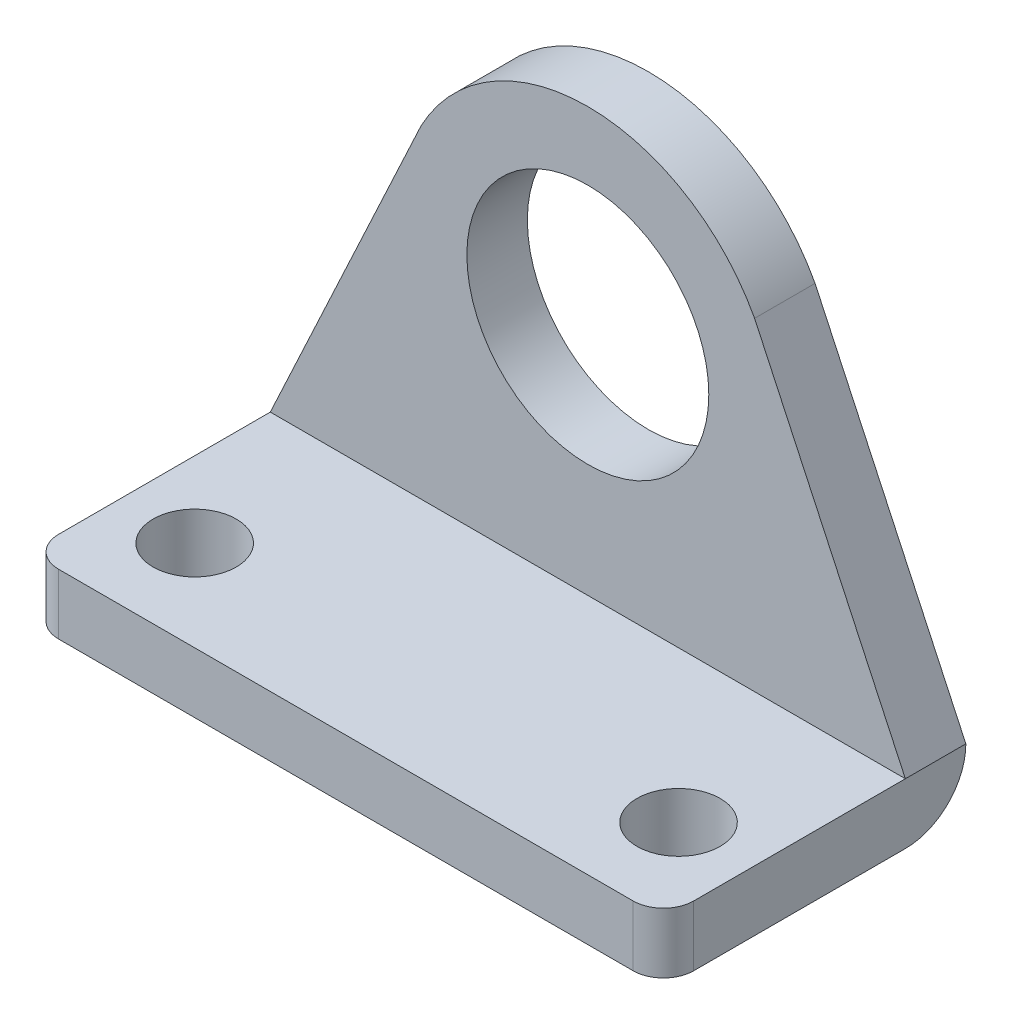
ISO-10303-21;
HEADER;
FILE_DESCRIPTION(('STEP AP214'),'2;1');
FILE_NAME('part.step','',(''),(''),'','','');
FILE_SCHEMA(('AUTOMOTIVE_DESIGN { 1 0 10303 214 1 1 1 1 }'));
ENDSEC;
DATA;
#1=APPLICATION_CONTEXT('core data for automotive mechanical design processes');
#2=APPLICATION_PROTOCOL_DEFINITION('international standard','automotive_design',2000,#1);
#3=PRODUCT_CONTEXT('',#1,'mechanical');
#4=PRODUCT('Part','Part','',(#3));
#5=PRODUCT_RELATED_PRODUCT_CATEGORY('part','',(#4));
#6=PRODUCT_DEFINITION_FORMATION('','',#4);
#7=PRODUCT_DEFINITION_CONTEXT('part definition',#1,'design');
#8=PRODUCT_DEFINITION('design','',#6,#7);
#9=PRODUCT_DEFINITION_SHAPE('','',#8);
#10=(LENGTH_UNIT() NAMED_UNIT(*) SI_UNIT(.MILLI.,.METRE.));
#11=(NAMED_UNIT(*) PLANE_ANGLE_UNIT() SI_UNIT($,.RADIAN.));
#12=(NAMED_UNIT(*) SI_UNIT($,.STERADIAN.) SOLID_ANGLE_UNIT());
#13=UNCERTAINTY_MEASURE_WITH_UNIT(LENGTH_MEASURE(1.E-05),#10,'distance_accuracy_value','');
#14=(GEOMETRIC_REPRESENTATION_CONTEXT(3) GLOBAL_UNCERTAINTY_ASSIGNED_CONTEXT((#13)) GLOBAL_UNIT_ASSIGNED_CONTEXT((#10,
#11,#12)) REPRESENTATION_CONTEXT('',''));
#15=CARTESIAN_POINT('',(0.,0.,0.));
#16=DIRECTION('',(0.,0.,1.));
#17=DIRECTION('',(1.,0.,0.));
#18=AXIS2_PLACEMENT_3D('',#15,#16,#17);
#19=CARTESIAN_POINT('',(21.,15.5,4.));
#20=DIRECTION('',(0.,0.,-1.));
#21=DIRECTION('',(-1.,0.,0.));
#22=AXIS2_PLACEMENT_3D('',#19,#20,#21);
#23=PLANE('',#22);
#24=DIRECTION('',(-0.422618261740697,-0.906307787036651,0.));
#25=VECTOR('',#24,1.);
#26=CARTESIAN_POINT('',(0.,0.,4.));
#27=LINE('',#26,#25);
#28=CARTESIAN_POINT('',(9.9719121218709,21.3848345560655,4.));
#29=VERTEX_POINT('',#28);
#30=CARTESIAN_POINT('',(0.,0.,4.));
#31=VERTEX_POINT('',#30);
#32=EDGE_CURVE('E177',#29,#31,#27,.T.);
#33=ORIENTED_EDGE('',*,*,#32,.T.);
#34=DIRECTION('',(1.,0.,0.));
#35=VECTOR('',#34,1.);
#36=CARTESIAN_POINT('',(42.,0.,4.));
#37=LINE('',#36,#35);
#38=CARTESIAN_POINT('',(42.,0.,4.));
#39=VERTEX_POINT('',#38);
#40=EDGE_CURVE('E216',#31,#39,#37,.T.);
#41=ORIENTED_EDGE('',*,*,#40,.T.);
#42=DIRECTION('',(-0.422618261740697,0.906307787036651,0.));
#43=VECTOR('',#42,1.);
#44=CARTESIAN_POINT('',(32.0280878781291,21.3848345560655,4.));
#45=LINE('',#44,#43);
#46=CARTESIAN_POINT('',(32.0280878781291,21.3848345560655,4.));
#47=VERTEX_POINT('',#46);
#48=EDGE_CURVE('E171',#39,#47,#45,.T.);
#49=ORIENTED_EDGE('',*,*,#48,.T.);
#50=CARTESIAN_POINT('',(21.,15.5,4.));
#51=DIRECTION('',(0.,0.,1.));
#52=DIRECTION('',(-1.,0.,0.));
#53=AXIS2_PLACEMENT_3D('',#50,#51,#52);
#54=CIRCLE('',#53,12.5);
#55=EDGE_CURVE('E63',#47,#29,#54,.T.);
#56=ORIENTED_EDGE('',*,*,#55,.T.);
#57=EDGE_LOOP('',(#33,#41,#49,#56));
#58=FACE_BOUND('',#57,.T.);
#59=CARTESIAN_POINT('',(21.,15.5,4.));
#60=DIRECTION('',(0.,0.,1.));
#61=DIRECTION('',(1.,0.,0.));
#62=AXIS2_PLACEMENT_3D('',#59,#60,#61);
#63=CIRCLE('',#62,8.);
#64=CARTESIAN_POINT('',(29.,15.5,4.));
#65=VERTEX_POINT('',#64);
#66=EDGE_CURVE('E161',#65,#65,#63,.T.);
#67=ORIENTED_EDGE('',*,*,#66,.F.);
#68=EDGE_LOOP('',(#67));
#69=FACE_BOUND('',#68,.T.);
#70=ADVANCED_FACE('F45',(#58,#69),#23,.F.);
#71=CARTESIAN_POINT('',(21.,15.5,0.));
#72=DIRECTION('',(0.,0.,-1.));
#73=DIRECTION('',(-1.,0.,0.));
#74=AXIS2_PLACEMENT_3D('',#71,#72,#73);
#75=PLANE('',#74);
#76=DIRECTION('',(1.,0.,0.));
#77=VECTOR('',#76,1.);
#78=CARTESIAN_POINT('',(0.,0.,0.));
#79=LINE('',#78,#77);
#80=CARTESIAN_POINT('',(0.,0.,0.));
#81=VERTEX_POINT('',#80);
#82=CARTESIAN_POINT('',(42.,0.,0.));
#83=VERTEX_POINT('',#82);
#84=EDGE_CURVE('E155',#81,#83,#79,.T.);
#85=ORIENTED_EDGE('',*,*,#84,.F.);
#86=DIRECTION('',(-0.422618261740697,-0.906307787036651,0.));
#87=VECTOR('',#86,1.);
#88=CARTESIAN_POINT('',(0.,0.,0.));
#89=LINE('',#88,#87);
#90=CARTESIAN_POINT('',(9.9719121218709,21.3848345560655,0.));
#91=VERTEX_POINT('',#90);
#92=EDGE_CURVE('E174',#91,#81,#89,.T.);
#93=ORIENTED_EDGE('',*,*,#92,.F.);
#94=CARTESIAN_POINT('',(21.,15.5,0.));
#95=DIRECTION('',(0.,0.,1.));
#96=DIRECTION('',(-1.,0.,0.));
#97=AXIS2_PLACEMENT_3D('',#94,#95,#96);
#98=CIRCLE('',#97,12.5);
#99=CARTESIAN_POINT('',(32.0280878781291,21.3848345560655,0.));
#100=VERTEX_POINT('',#99);
#101=EDGE_CURVE('E81',#100,#91,#98,.T.);
#102=ORIENTED_EDGE('',*,*,#101,.F.);
#103=DIRECTION('',(-0.422618261740697,0.906307787036651,0.));
#104=VECTOR('',#103,1.);
#105=CARTESIAN_POINT('',(32.0280878781291,21.3848345560655,0.));
#106=LINE('',#105,#104);
#107=EDGE_CURVE('E76',#83,#100,#106,.T.);
#108=ORIENTED_EDGE('',*,*,#107,.F.);
#109=EDGE_LOOP('',(#85,#93,#102,#108));
#110=FACE_BOUND('',#109,.T.);
#111=CARTESIAN_POINT('',(21.,15.5,0.));
#112=DIRECTION('',(0.,0.,1.));
#113=DIRECTION('',(1.,0.,0.));
#114=AXIS2_PLACEMENT_3D('',#111,#112,#113);
#115=CIRCLE('',#114,8.);
#116=CARTESIAN_POINT('',(29.,15.5,0.));
#117=VERTEX_POINT('',#116);
#118=EDGE_CURVE('E157',#117,#117,#115,.T.);
#119=ORIENTED_EDGE('',*,*,#118,.T.);
#120=EDGE_LOOP('',(#119));
#121=FACE_BOUND('',#120,.T.);
#122=ADVANCED_FACE('F200',(#110,#121),#75,.T.);
#123=CARTESIAN_POINT('',(32.0280878781291,21.3848345560655,4.));
#124=DIRECTION('',(-0.906307787036651,-0.422618261740697,0.));
#125=DIRECTION('',(0.422618261740697,-0.906307787036651,0.));
#126=AXIS2_PLACEMENT_3D('',#123,#124,#125);
#127=PLANE('',#126);
#128=ORIENTED_EDGE('',*,*,#107,.T.);
#129=DIRECTION('',(0.,0.,-1.));
#130=VECTOR('',#129,1.);
#131=CARTESIAN_POINT('',(32.0280878781291,21.3848345560655,4.));
#132=LINE('',#131,#130);
#133=EDGE_CURVE('E55',#47,#100,#132,.T.);
#134=ORIENTED_EDGE('',*,*,#133,.F.);
#135=ORIENTED_EDGE('',*,*,#48,.F.);
#136=DIRECTION('',(0.,0.,-1.));
#137=VECTOR('',#136,1.);
#138=CARTESIAN_POINT('',(42.,0.,4.));
#139=LINE('',#138,#137);
#140=EDGE_CURVE('E11',#39,#83,#139,.T.);
#141=ORIENTED_EDGE('',*,*,#140,.T.);
#142=EDGE_LOOP('',(#128,#134,#135,#141));
#143=FACE_BOUND('',#142,.T.);
#144=ADVANCED_FACE('F47',(#143),#127,.F.);
#145=CARTESIAN_POINT('',(21.,15.5,4.));
#146=DIRECTION('',(0.,0.,-1.));
#147=DIRECTION('',(-1.,0.,0.));
#148=AXIS2_PLACEMENT_3D('',#145,#146,#147);
#149=CYLINDRICAL_SURFACE('',#148,12.5);
#150=ORIENTED_EDGE('',*,*,#101,.T.);
#151=DIRECTION('',(0.,0.,-1.));
#152=VECTOR('',#151,1.);
#153=CARTESIAN_POINT('',(9.9719121218709,21.3848345560655,4.));
#154=LINE('',#153,#152);
#155=EDGE_CURVE('E193',#29,#91,#154,.T.);
#156=ORIENTED_EDGE('',*,*,#155,.F.);
#157=ORIENTED_EDGE('',*,*,#55,.F.);
#158=ORIENTED_EDGE('',*,*,#133,.T.);
#159=EDGE_LOOP('',(#150,#156,#157,#158));
#160=FACE_BOUND('',#159,.T.);
#161=ADVANCED_FACE('F196',(#160),#149,.T.);
#162=CARTESIAN_POINT('',(0.,0.,4.));
#163=DIRECTION('',(0.906307787036651,-0.422618261740697,0.));
#164=DIRECTION('',(0.422618261740697,0.906307787036651,0.));
#165=AXIS2_PLACEMENT_3D('',#162,#163,#164);
#166=PLANE('',#165);
#167=ORIENTED_EDGE('',*,*,#92,.T.);
#168=DIRECTION('',(0.,0.,-1.));
#169=VECTOR('',#168,1.);
#170=CARTESIAN_POINT('',(0.,0.,4.));
#171=LINE('',#170,#169);
#172=EDGE_CURVE('E180',#31,#81,#171,.T.);
#173=ORIENTED_EDGE('',*,*,#172,.F.);
#174=ORIENTED_EDGE('',*,*,#32,.F.);
#175=ORIENTED_EDGE('',*,*,#155,.T.);
#176=EDGE_LOOP('',(#167,#173,#174,#175));
#177=FACE_BOUND('',#176,.T.);
#178=ADVANCED_FACE('F204',(#177),#166,.F.);
#179=CARTESIAN_POINT('',(21.,15.5,4.));
#180=DIRECTION('',(0.,0.,-1.));
#181=DIRECTION('',(-1.,0.,0.));
#182=AXIS2_PLACEMENT_3D('',#179,#180,#181);
#183=CYLINDRICAL_SURFACE('',#182,8.);
#184=ORIENTED_EDGE('',*,*,#66,.T.);
#185=EDGE_LOOP('',(#184));
#186=FACE_BOUND('',#185,.T.);
#187=ORIENTED_EDGE('',*,*,#118,.F.);
#188=EDGE_LOOP('',(#187));
#189=FACE_BOUND('',#188,.T.);
#190=ADVANCED_FACE('F227',(#186,#189),#183,.F.);
#191=CARTESIAN_POINT('',(47.6568542494924,0.,4.00000000000001));
#192=DIRECTION('',(-1.,0.,0.));
#193=DIRECTION('',(0.,0.,1.));
#194=AXIS2_PLACEMENT_3D('',#191,#192,#193);
#195=CYLINDRICAL_SURFACE('',#194,4.);
#196=CARTESIAN_POINT('',(42.,0.,4.00000000000001));
#197=DIRECTION('',(-1.,0.,0.));
#198=DIRECTION('',(0.,0.,1.));
#199=AXIS2_PLACEMENT_3D('',#196,#197,#198);
#200=CIRCLE('',#199,4.);
#201=CARTESIAN_POINT('',(42.,-4.,4.));
#202=VERTEX_POINT('',#201);
#203=EDGE_CURVE('E132',#202,#83,#200,.F.);
#204=ORIENTED_EDGE('',*,*,#203,.F.);
#205=DIRECTION('',(-1.,0.,0.));
#206=VECTOR('',#205,1.);
#207=CARTESIAN_POINT('',(47.6568542494924,-4.,4.00000000000001));
#208=LINE('',#207,#206);
#209=CARTESIAN_POINT('',(0.,-4.,4.));
#210=VERTEX_POINT('',#209);
#211=EDGE_CURVE('E143',#202,#210,#208,.T.);
#212=ORIENTED_EDGE('',*,*,#211,.T.);
#213=CARTESIAN_POINT('',(0.,0.,4.));
#214=DIRECTION('',(-1.,0.,0.));
#215=DIRECTION('',(0.,0.,1.));
#216=AXIS2_PLACEMENT_3D('',#213,#214,#215);
#217=CIRCLE('',#216,4.);
#218=EDGE_CURVE('E152',#81,#210,#217,.T.);
#219=ORIENTED_EDGE('',*,*,#218,.F.);
#220=ORIENTED_EDGE('',*,*,#84,.T.);
#221=EDGE_LOOP('',(#204,#212,#219,#220));
#222=FACE_BOUND('',#221,.T.);
#223=ADVANCED_FACE('F154',(#222),#195,.T.);
#224=CARTESIAN_POINT('',(0.,0.,4.));
#225=DIRECTION('',(-1.,0.,0.));
#226=DIRECTION('',(0.,0.,1.));
#227=AXIS2_PLACEMENT_3D('',#224,#225,#226);
#228=PLANE('',#227);
#229=ORIENTED_EDGE('',*,*,#218,.T.);
#230=DIRECTION('',(0.,0.,-1.));
#231=VECTOR('',#230,1.);
#232=CARTESIAN_POINT('',(0.,-4.,4.));
#233=LINE('',#232,#231);
#234=CARTESIAN_POINT('',(0.,-4.,18.));
#235=VERTEX_POINT('',#234);
#236=EDGE_CURVE('E147',#235,#210,#233,.T.);
#237=ORIENTED_EDGE('',*,*,#236,.F.);
#238=DIRECTION('',(0.,1.,0.));
#239=VECTOR('',#238,1.);
#240=CARTESIAN_POINT('',(0.,-4.,18.));
#241=LINE('',#240,#239);
#242=CARTESIAN_POINT('',(0.,0.,18.));
#243=VERTEX_POINT('',#242);
#244=EDGE_CURVE('E211',#235,#243,#241,.T.);
#245=ORIENTED_EDGE('',*,*,#244,.T.);
#246=DIRECTION('',(0.,0.,-1.));
#247=VECTOR('',#246,1.);
#248=CARTESIAN_POINT('',(0.,0.,4.));
#249=LINE('',#248,#247);
#250=EDGE_CURVE('E140',#243,#31,#249,.T.);
#251=ORIENTED_EDGE('',*,*,#250,.T.);
#252=ORIENTED_EDGE('',*,*,#172,.T.);
#253=EDGE_LOOP('',(#229,#237,#245,#251,#252));
#254=FACE_BOUND('',#253,.T.);
#255=ADVANCED_FACE('F207',(#254),#228,.T.);
#256=CARTESIAN_POINT('',(42.,-4.,18.));
#257=DIRECTION('',(-1.,0.,0.));
#258=DIRECTION('',(0.,0.,1.));
#259=AXIS2_PLACEMENT_3D('',#256,#257,#258);
#260=PLANE('',#259);
#261=ORIENTED_EDGE('',*,*,#140,.F.);
#262=DIRECTION('',(0.,0.,1.));
#263=VECTOR('',#262,1.);
#264=CARTESIAN_POINT('',(42.,0.,18.));
#265=LINE('',#264,#263);
#266=CARTESIAN_POINT('',(42.,0.,18.));
#267=VERTEX_POINT('',#266);
#268=EDGE_CURVE('E88',#39,#267,#265,.T.);
#269=ORIENTED_EDGE('',*,*,#268,.T.);
#270=DIRECTION('',(0.,1.,0.));
#271=VECTOR('',#270,1.);
#272=CARTESIAN_POINT('',(42.,-4.,18.));
#273=LINE('',#272,#271);
#274=CARTESIAN_POINT('',(42.,-4.,18.));
#275=VERTEX_POINT('',#274);
#276=EDGE_CURVE('E135',#275,#267,#273,.T.);
#277=ORIENTED_EDGE('',*,*,#276,.F.);
#278=DIRECTION('',(0.,0.,1.));
#279=VECTOR('',#278,1.);
#280=CARTESIAN_POINT('',(42.,-4.,18.));
#281=LINE('',#280,#279);
#282=EDGE_CURVE('E127',#202,#275,#281,.T.);
#283=ORIENTED_EDGE('',*,*,#282,.F.);
#284=ORIENTED_EDGE('',*,*,#203,.T.);
#285=EDGE_LOOP('',(#261,#269,#277,#283,#284));
#286=FACE_BOUND('',#285,.T.);
#287=ADVANCED_FACE('F130',(#286),#260,.F.);
#288=CARTESIAN_POINT('',(2.,-4.,18.));
#289=DIRECTION('',(0.,-1.,0.));
#290=DIRECTION('',(0.,0.,-1.));
#291=AXIS2_PLACEMENT_3D('',#288,#289,#290);
#292=PLANE('',#291);
#293=CARTESIAN_POINT('',(37.,-4.,14.));
#294=DIRECTION('',(0.,-1.,0.));
#295=DIRECTION('',(0.,0.,-1.));
#296=AXIS2_PLACEMENT_3D('',#293,#294,#295);
#297=CIRCLE('',#296,2.75);
#298=CARTESIAN_POINT('',(37.,-4.,11.25));
#299=VERTEX_POINT('',#298);
#300=EDGE_CURVE('E220',#299,#299,#297,.T.);
#301=ORIENTED_EDGE('',*,*,#300,.F.);
#302=EDGE_LOOP('',(#301));
#303=FACE_BOUND('',#302,.T.);
#304=ORIENTED_EDGE('',*,*,#211,.F.);
#305=ORIENTED_EDGE('',*,*,#282,.T.);
#306=CARTESIAN_POINT('',(40.,-4.,18.));
#307=DIRECTION('',(0.,-1.,0.));
#308=DIRECTION('',(0.,0.,1.));
#309=AXIS2_PLACEMENT_3D('',#306,#307,#308);
#310=CIRCLE('',#309,2.);
#311=CARTESIAN_POINT('',(40.,-4.,20.));
#312=VERTEX_POINT('',#311);
#313=EDGE_CURVE('E139',#275,#312,#310,.T.);
#314=ORIENTED_EDGE('',*,*,#313,.T.);
#315=DIRECTION('',(-1.,0.,0.));
#316=VECTOR('',#315,1.);
#317=CARTESIAN_POINT('',(2.00000000000001,-4.,20.));
#318=LINE('',#317,#316);
#319=CARTESIAN_POINT('',(2.00000000000001,-4.,20.));
#320=VERTEX_POINT('',#319);
#321=EDGE_CURVE('E379',#312,#320,#318,.T.);
#322=ORIENTED_EDGE('',*,*,#321,.T.);
#323=CARTESIAN_POINT('',(2.,-4.,18.));
#324=DIRECTION('',(0.,-1.,0.));
#325=DIRECTION('',(0.,0.,-1.));
#326=AXIS2_PLACEMENT_3D('',#323,#324,#325);
#327=CIRCLE('',#326,2.);
#328=EDGE_CURVE('E382',#320,#235,#327,.T.);
#329=ORIENTED_EDGE('',*,*,#328,.T.);
#330=ORIENTED_EDGE('',*,*,#236,.T.);
#331=EDGE_LOOP('',(#304,#305,#314,#322,#329,#330));
#332=FACE_BOUND('',#331,.T.);
#333=CARTESIAN_POINT('',(5.,-4.,14.));
#334=DIRECTION('',(0.,-1.,0.));
#335=DIRECTION('',(0.,0.,-1.));
#336=AXIS2_PLACEMENT_3D('',#333,#334,#335);
#337=CIRCLE('',#336,2.75);
#338=CARTESIAN_POINT('',(5.,-4.,11.25));
#339=VERTEX_POINT('',#338);
#340=EDGE_CURVE('E360',#339,#339,#337,.T.);
#341=ORIENTED_EDGE('',*,*,#340,.F.);
#342=EDGE_LOOP('',(#341));
#343=FACE_BOUND('',#342,.T.);
#344=ADVANCED_FACE('F144',(#303,#332,#343),#292,.T.);
#345=CARTESIAN_POINT('',(2.,0.,18.));
#346=DIRECTION('',(0.,-1.,0.));
#347=DIRECTION('',(0.,0.,-1.));
#348=AXIS2_PLACEMENT_3D('',#345,#346,#347);
#349=PLANE('',#348);
#350=ORIENTED_EDGE('',*,*,#40,.F.);
#351=ORIENTED_EDGE('',*,*,#250,.F.);
#352=CARTESIAN_POINT('',(2.,0.,18.));
#353=DIRECTION('',(0.,-1.,0.));
#354=DIRECTION('',(0.,0.,-1.));
#355=AXIS2_PLACEMENT_3D('',#352,#353,#354);
#356=CIRCLE('',#355,2.);
#357=CARTESIAN_POINT('',(2.00000000000001,0.,20.));
#358=VERTEX_POINT('',#357);
#359=EDGE_CURVE('E214',#358,#243,#356,.T.);
#360=ORIENTED_EDGE('',*,*,#359,.F.);
#361=DIRECTION('',(-1.,0.,0.));
#362=VECTOR('',#361,1.);
#363=CARTESIAN_POINT('',(2.00000000000001,0.,20.));
#364=LINE('',#363,#362);
#365=CARTESIAN_POINT('',(40.,0.,20.));
#366=VERTEX_POINT('',#365);
#367=EDGE_CURVE('E392',#366,#358,#364,.T.);
#368=ORIENTED_EDGE('',*,*,#367,.F.);
#369=CARTESIAN_POINT('',(40.,0.,18.));
#370=DIRECTION('',(0.,-1.,0.));
#371=DIRECTION('',(0.,0.,1.));
#372=AXIS2_PLACEMENT_3D('',#369,#370,#371);
#373=CIRCLE('',#372,2.);
#374=EDGE_CURVE('E389',#267,#366,#373,.T.);
#375=ORIENTED_EDGE('',*,*,#374,.F.);
#376=ORIENTED_EDGE('',*,*,#268,.F.);
#377=EDGE_LOOP('',(#350,#351,#360,#368,#375,#376));
#378=FACE_BOUND('',#377,.T.);
#379=CARTESIAN_POINT('',(37.,0.,14.));
#380=DIRECTION('',(0.,-1.,0.));
#381=DIRECTION('',(0.,0.,-1.));
#382=AXIS2_PLACEMENT_3D('',#379,#380,#381);
#383=CIRCLE('',#382,2.75);
#384=CARTESIAN_POINT('',(37.,0.,11.25));
#385=VERTEX_POINT('',#384);
#386=EDGE_CURVE('E368',#385,#385,#383,.T.);
#387=ORIENTED_EDGE('',*,*,#386,.T.);
#388=EDGE_LOOP('',(#387));
#389=FACE_BOUND('',#388,.T.);
#390=CARTESIAN_POINT('',(5.,0.,14.));
#391=DIRECTION('',(0.,-1.,0.));
#392=DIRECTION('',(0.,0.,-1.));
#393=AXIS2_PLACEMENT_3D('',#390,#391,#392);
#394=CIRCLE('',#393,2.75);
#395=CARTESIAN_POINT('',(5.,0.,11.25));
#396=VERTEX_POINT('',#395);
#397=EDGE_CURVE('E363',#396,#396,#394,.T.);
#398=ORIENTED_EDGE('',*,*,#397,.T.);
#399=EDGE_LOOP('',(#398));
#400=FACE_BOUND('',#399,.T.);
#401=ADVANCED_FACE('F217',(#378,#389,#400),#349,.F.);
#402=CARTESIAN_POINT('',(40.,-4.,18.));
#403=DIRECTION('',(0.,1.,0.));
#404=DIRECTION('',(0.,0.,1.));
#405=AXIS2_PLACEMENT_3D('',#402,#403,#404);
#406=CYLINDRICAL_SURFACE('',#405,2.);
#407=ORIENTED_EDGE('',*,*,#374,.T.);
#408=DIRECTION('',(0.,1.,0.));
#409=VECTOR('',#408,1.);
#410=CARTESIAN_POINT('',(40.,-4.,20.));
#411=LINE('',#410,#409);
#412=EDGE_CURVE('E402',#312,#366,#411,.T.);
#413=ORIENTED_EDGE('',*,*,#412,.F.);
#414=ORIENTED_EDGE('',*,*,#313,.F.);
#415=ORIENTED_EDGE('',*,*,#276,.T.);
#416=EDGE_LOOP('',(#407,#413,#414,#415));
#417=FACE_BOUND('',#416,.T.);
#418=ADVANCED_FACE('F300',(#417),#406,.T.);
#419=CARTESIAN_POINT('',(2.00000000000001,-4.,20.));
#420=DIRECTION('',(0.,0.,-1.));
#421=DIRECTION('',(-1.,0.,0.));
#422=AXIS2_PLACEMENT_3D('',#419,#420,#421);
#423=PLANE('',#422);
#424=ORIENTED_EDGE('',*,*,#367,.T.);
#425=DIRECTION('',(0.,1.,0.));
#426=VECTOR('',#425,1.);
#427=CARTESIAN_POINT('',(2.00000000000001,-4.,20.));
#428=LINE('',#427,#426);
#429=EDGE_CURVE('E399',#320,#358,#428,.T.);
#430=ORIENTED_EDGE('',*,*,#429,.F.);
#431=ORIENTED_EDGE('',*,*,#321,.F.);
#432=ORIENTED_EDGE('',*,*,#412,.T.);
#433=EDGE_LOOP('',(#424,#430,#431,#432));
#434=FACE_BOUND('',#433,.T.);
#435=ADVANCED_FACE('F307',(#434),#423,.F.);
#436=CARTESIAN_POINT('',(2.,-4.,18.));
#437=DIRECTION('',(0.,1.,0.));
#438=DIRECTION('',(0.,0.,1.));
#439=AXIS2_PLACEMENT_3D('',#436,#437,#438);
#440=CYLINDRICAL_SURFACE('',#439,2.);
#441=ORIENTED_EDGE('',*,*,#359,.T.);
#442=ORIENTED_EDGE('',*,*,#244,.F.);
#443=ORIENTED_EDGE('',*,*,#328,.F.);
#444=ORIENTED_EDGE('',*,*,#429,.T.);
#445=EDGE_LOOP('',(#441,#442,#443,#444));
#446=FACE_BOUND('',#445,.T.);
#447=ADVANCED_FACE('F315',(#446),#440,.T.);
#448=CARTESIAN_POINT('',(37.,-4.,14.));
#449=DIRECTION('',(0.,1.,0.));
#450=DIRECTION('',(0.,0.,1.));
#451=AXIS2_PLACEMENT_3D('',#448,#449,#450);
#452=CYLINDRICAL_SURFACE('',#451,2.75);
#453=ORIENTED_EDGE('',*,*,#300,.T.);
#454=EDGE_LOOP('',(#453));
#455=FACE_BOUND('',#454,.T.);
#456=ORIENTED_EDGE('',*,*,#386,.F.);
#457=EDGE_LOOP('',(#456));
#458=FACE_BOUND('',#457,.T.);
#459=ADVANCED_FACE('F323',(#455,#458),#452,.F.);
#460=CARTESIAN_POINT('',(5.,-4.,14.));
#461=DIRECTION('',(0.,1.,0.));
#462=DIRECTION('',(0.,0.,1.));
#463=AXIS2_PLACEMENT_3D('',#460,#461,#462);
#464=CYLINDRICAL_SURFACE('',#463,2.75);
#465=ORIENTED_EDGE('',*,*,#340,.T.);
#466=EDGE_LOOP('',(#465));
#467=FACE_BOUND('',#466,.T.);
#468=ORIENTED_EDGE('',*,*,#397,.F.);
#469=EDGE_LOOP('',(#468));
#470=FACE_BOUND('',#469,.T.);
#471=ADVANCED_FACE('F331',(#467,#470),#464,.F.);
#472=CLOSED_SHELL('',(#70,#122,#144,#161,#178,#190,#223,#255,#287,#344,#401,#418,#435,#447,#459,#471));
#473=MANIFOLD_SOLID_BREP('B2',#472);
#474=ADVANCED_BREP_SHAPE_REPRESENTATION('',(#18,#473),#14);
#475=SHAPE_DEFINITION_REPRESENTATION(#9,#474);
ENDSEC;
END-ISO-10303-21;
